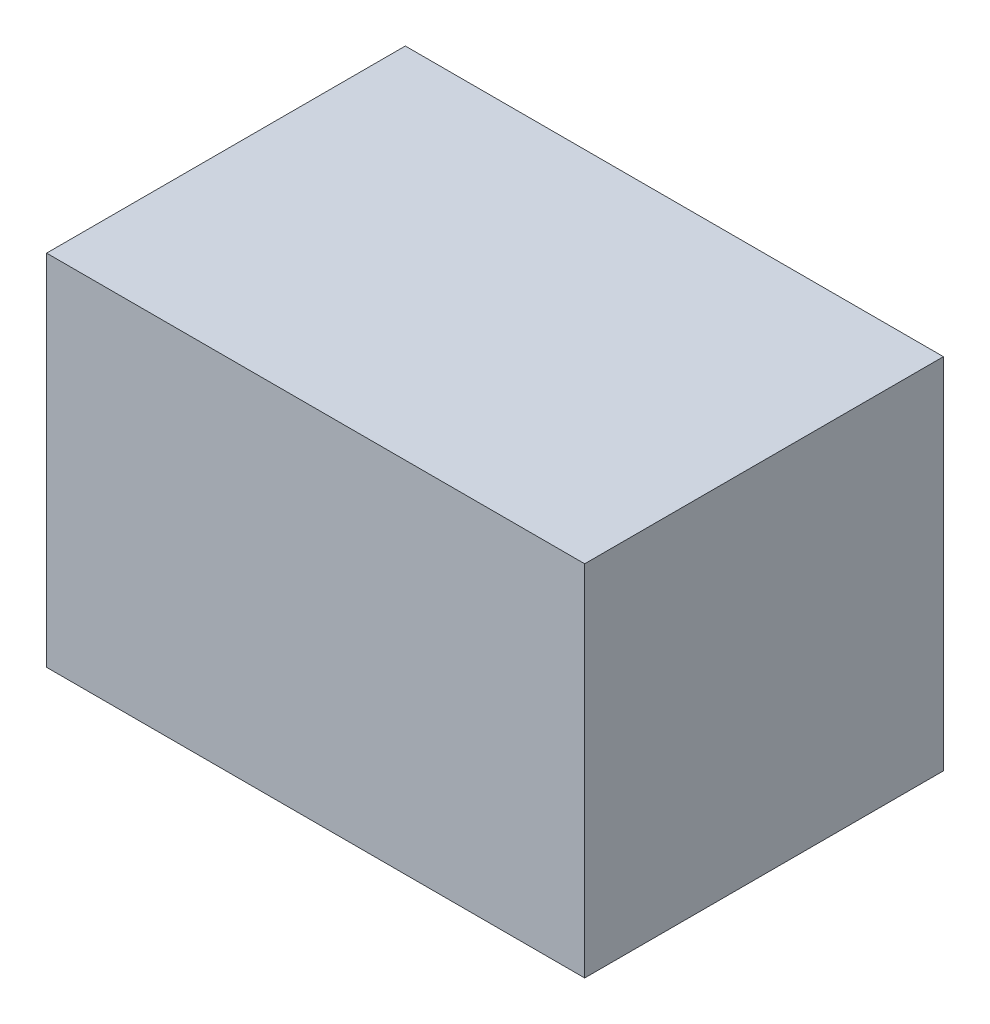
ISO-10303-21;
HEADER;
FILE_DESCRIPTION(('STEP AP214'),'2;1');
FILE_NAME('part.step','',(''),(''),'','','');
FILE_SCHEMA(('AUTOMOTIVE_DESIGN { 1 0 10303 214 1 1 1 1 }'));
ENDSEC;
DATA;
#1=APPLICATION_CONTEXT('core data for automotive mechanical design processes');
#2=APPLICATION_PROTOCOL_DEFINITION('international standard','automotive_design',2000,#1);
#3=PRODUCT_CONTEXT('',#1,'mechanical');
#4=PRODUCT('Part','Part','',(#3));
#5=PRODUCT_RELATED_PRODUCT_CATEGORY('part','',(#4));
#6=PRODUCT_DEFINITION_FORMATION('','',#4);
#7=PRODUCT_DEFINITION_CONTEXT('part definition',#1,'design');
#8=PRODUCT_DEFINITION('design','',#6,#7);
#9=PRODUCT_DEFINITION_SHAPE('','',#8);
#10=(LENGTH_UNIT() NAMED_UNIT(*) SI_UNIT(.MILLI.,.METRE.));
#11=(NAMED_UNIT(*) PLANE_ANGLE_UNIT() SI_UNIT($,.RADIAN.));
#12=(NAMED_UNIT(*) SI_UNIT($,.STERADIAN.) SOLID_ANGLE_UNIT());
#13=UNCERTAINTY_MEASURE_WITH_UNIT(LENGTH_MEASURE(1.E-05),#10,'distance_accuracy_value','');
#14=(GEOMETRIC_REPRESENTATION_CONTEXT(3) GLOBAL_UNCERTAINTY_ASSIGNED_CONTEXT((#13)) GLOBAL_UNIT_ASSIGNED_CONTEXT((#10,
#11,#12)) REPRESENTATION_CONTEXT('',''));
#15=CARTESIAN_POINT('',(0.,0.,0.));
#16=DIRECTION('',(0.,0.,1.));
#17=DIRECTION('',(1.,0.,0.));
#18=AXIS2_PLACEMENT_3D('',#15,#16,#17);
#19=CARTESIAN_POINT('',(75.,100.,50.));
#20=DIRECTION('',(-1.,0.,0.));
#21=DIRECTION('',(0.,0.,1.));
#22=AXIS2_PLACEMENT_3D('',#19,#20,#21);
#23=PLANE('',#22);
#24=DIRECTION('',(0.,0.,-1.));
#25=VECTOR('',#24,1.);
#26=CARTESIAN_POINT('',(75.,0.,50.));
#27=LINE('',#26,#25);
#28=CARTESIAN_POINT('',(75.,0.,50.));
#29=VERTEX_POINT('',#28);
#30=CARTESIAN_POINT('',(75.,0.,-50.));
#31=VERTEX_POINT('',#30);
#32=EDGE_CURVE('E97',#29,#31,#27,.T.);
#33=ORIENTED_EDGE('',*,*,#32,.T.);
#34=DIRECTION('',(0.,-1.,0.));
#35=VECTOR('',#34,1.);
#36=CARTESIAN_POINT('',(75.,100.,-50.));
#37=LINE('',#36,#35);
#38=CARTESIAN_POINT('',(75.,100.,-50.));
#39=VERTEX_POINT('',#38);
#40=EDGE_CURVE('E11',#39,#31,#37,.T.);
#41=ORIENTED_EDGE('',*,*,#40,.F.);
#42=DIRECTION('',(0.,0.,-1.));
#43=VECTOR('',#42,1.);
#44=CARTESIAN_POINT('',(75.,100.,50.));
#45=LINE('',#44,#43);
#46=CARTESIAN_POINT('',(75.,100.,50.));
#47=VERTEX_POINT('',#46);
#48=EDGE_CURVE('E85',#47,#39,#45,.T.);
#49=ORIENTED_EDGE('',*,*,#48,.F.);
#50=DIRECTION('',(0.,-1.,0.));
#51=VECTOR('',#50,1.);
#52=CARTESIAN_POINT('',(75.,100.,50.));
#53=LINE('',#52,#51);
#54=EDGE_CURVE('E93',#47,#29,#53,.T.);
#55=ORIENTED_EDGE('',*,*,#54,.T.);
#56=EDGE_LOOP('',(#33,#41,#49,#55));
#57=FACE_BOUND('',#56,.T.);
#58=ADVANCED_FACE('F34',(#57),#23,.F.);
#59=CARTESIAN_POINT('',(-75.,100.,-50.));
#60=DIRECTION('',(0.,0.,1.));
#61=DIRECTION('',(1.,0.,0.));
#62=AXIS2_PLACEMENT_3D('',#59,#60,#61);
#63=PLANE('',#62);
#64=DIRECTION('',(-1.,0.,0.));
#65=VECTOR('',#64,1.);
#66=CARTESIAN_POINT('',(-75.,0.,-50.));
#67=LINE('',#66,#65);
#68=CARTESIAN_POINT('',(-75.,0.,-50.));
#69=VERTEX_POINT('',#68);
#70=EDGE_CURVE('E89',#31,#69,#67,.T.);
#71=ORIENTED_EDGE('',*,*,#70,.T.);
#72=DIRECTION('',(0.,-1.,0.));
#73=VECTOR('',#72,1.);
#74=CARTESIAN_POINT('',(-75.,100.,-50.));
#75=LINE('',#74,#73);
#76=CARTESIAN_POINT('',(-75.,100.,-50.));
#77=VERTEX_POINT('',#76);
#78=EDGE_CURVE('E42',#77,#69,#75,.T.);
#79=ORIENTED_EDGE('',*,*,#78,.F.);
#80=DIRECTION('',(-1.,0.,0.));
#81=VECTOR('',#80,1.);
#82=CARTESIAN_POINT('',(-75.,100.,-50.));
#83=LINE('',#82,#81);
#84=EDGE_CURVE('E80',#39,#77,#83,.T.);
#85=ORIENTED_EDGE('',*,*,#84,.F.);
#86=ORIENTED_EDGE('',*,*,#40,.T.);
#87=EDGE_LOOP('',(#71,#79,#85,#86));
#88=FACE_BOUND('',#87,.T.);
#89=ADVANCED_FACE('F88',(#88),#63,.F.);
#90=CARTESIAN_POINT('',(-75.,100.,50.));
#91=DIRECTION('',(1.,0.,0.));
#92=DIRECTION('',(0.,0.,-1.));
#93=AXIS2_PLACEMENT_3D('',#90,#91,#92);
#94=PLANE('',#93);
#95=DIRECTION('',(0.,0.,1.));
#96=VECTOR('',#95,1.);
#97=CARTESIAN_POINT('',(-75.,0.,50.));
#98=LINE('',#97,#96);
#99=CARTESIAN_POINT('',(-75.,0.,50.));
#100=VERTEX_POINT('',#99);
#101=EDGE_CURVE('E67',#69,#100,#98,.T.);
#102=ORIENTED_EDGE('',*,*,#101,.T.);
#103=DIRECTION('',(0.,-1.,0.));
#104=VECTOR('',#103,1.);
#105=CARTESIAN_POINT('',(-75.,100.,50.));
#106=LINE('',#105,#104);
#107=CARTESIAN_POINT('',(-75.,100.,50.));
#108=VERTEX_POINT('',#107);
#109=EDGE_CURVE('E90',#108,#100,#106,.T.);
#110=ORIENTED_EDGE('',*,*,#109,.F.);
#111=DIRECTION('',(0.,0.,1.));
#112=VECTOR('',#111,1.);
#113=CARTESIAN_POINT('',(-75.,100.,50.));
#114=LINE('',#113,#112);
#115=EDGE_CURVE('E83',#77,#108,#114,.T.);
#116=ORIENTED_EDGE('',*,*,#115,.F.);
#117=ORIENTED_EDGE('',*,*,#78,.T.);
#118=EDGE_LOOP('',(#102,#110,#116,#117));
#119=FACE_BOUND('',#118,.T.);
#120=ADVANCED_FACE('F91',(#119),#94,.F.);
#121=CARTESIAN_POINT('',(-75.,100.,50.));
#122=DIRECTION('',(0.,0.,-1.));
#123=DIRECTION('',(-1.,0.,0.));
#124=AXIS2_PLACEMENT_3D('',#121,#122,#123);
#125=PLANE('',#124);
#126=DIRECTION('',(1.,0.,0.));
#127=VECTOR('',#126,1.);
#128=CARTESIAN_POINT('',(-75.,0.,50.));
#129=LINE('',#128,#127);
#130=EDGE_CURVE('E73',#100,#29,#129,.T.);
#131=ORIENTED_EDGE('',*,*,#130,.T.);
#132=ORIENTED_EDGE('',*,*,#54,.F.);
#133=DIRECTION('',(1.,0.,0.));
#134=VECTOR('',#133,1.);
#135=CARTESIAN_POINT('',(-75.,100.,50.));
#136=LINE('',#135,#134);
#137=EDGE_CURVE('E50',#108,#47,#136,.T.);
#138=ORIENTED_EDGE('',*,*,#137,.F.);
#139=ORIENTED_EDGE('',*,*,#109,.T.);
#140=EDGE_LOOP('',(#131,#132,#138,#139));
#141=FACE_BOUND('',#140,.T.);
#142=ADVANCED_FACE('F104',(#141),#125,.F.);
#143=CARTESIAN_POINT('',(0.,100.,0.));
#144=DIRECTION('',(0.,-1.,0.));
#145=DIRECTION('',(0.,0.,-1.));
#146=AXIS2_PLACEMENT_3D('',#143,#144,#145);
#147=PLANE('',#146);
#148=ORIENTED_EDGE('',*,*,#48,.T.);
#149=ORIENTED_EDGE('',*,*,#84,.T.);
#150=ORIENTED_EDGE('',*,*,#115,.T.);
#151=ORIENTED_EDGE('',*,*,#137,.T.);
#152=EDGE_LOOP('',(#148,#149,#150,#151));
#153=FACE_BOUND('',#152,.T.);
#154=ADVANCED_FACE('F81',(#153),#147,.F.);
#155=CARTESIAN_POINT('',(0.,0.,0.));
#156=DIRECTION('',(0.,-1.,0.));
#157=DIRECTION('',(0.,0.,-1.));
#158=AXIS2_PLACEMENT_3D('',#155,#156,#157);
#159=PLANE('',#158);
#160=ORIENTED_EDGE('',*,*,#32,.F.);
#161=ORIENTED_EDGE('',*,*,#130,.F.);
#162=ORIENTED_EDGE('',*,*,#101,.F.);
#163=ORIENTED_EDGE('',*,*,#70,.F.);
#164=EDGE_LOOP('',(#160,#161,#162,#163));
#165=FACE_BOUND('',#164,.T.);
#166=ADVANCED_FACE('F107',(#165),#159,.T.);
#167=CLOSED_SHELL('',(#58,#89,#120,#142,#154,#166));
#168=MANIFOLD_SOLID_BREP('B2',#167);
#169=ADVANCED_BREP_SHAPE_REPRESENTATION('',(#18,#168),#14);
#170=SHAPE_DEFINITION_REPRESENTATION(#9,#169);
ENDSEC;
END-ISO-10303-21;
